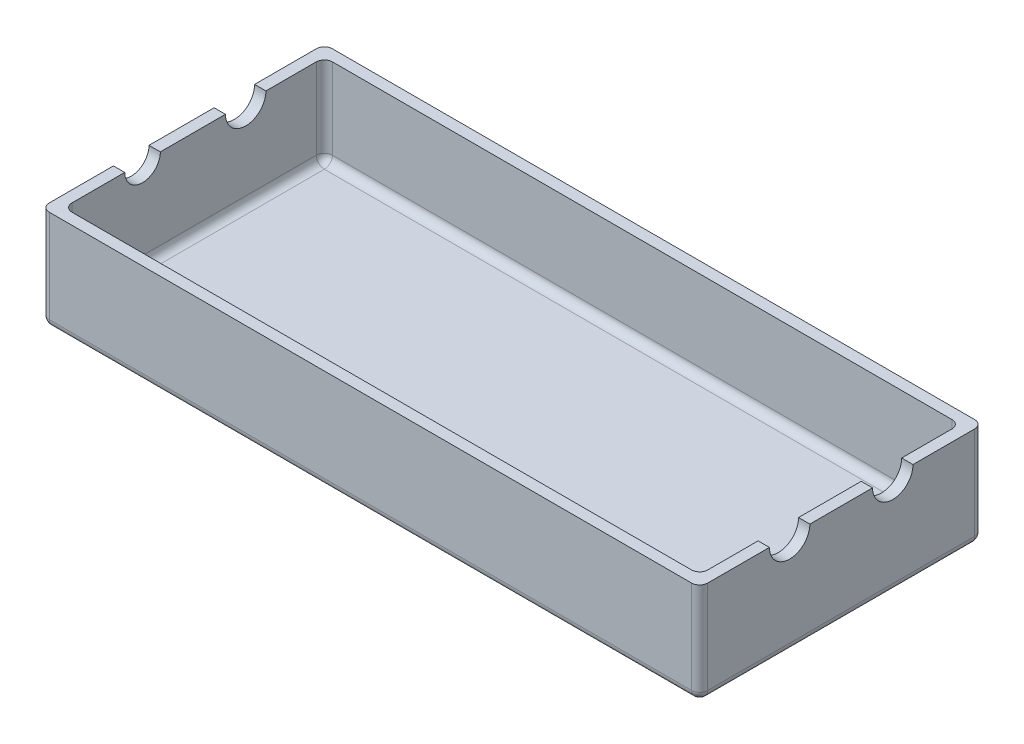
ISO-10303-21;
HEADER;
FILE_DESCRIPTION(('STEP AP214'),'2;1');
FILE_NAME('part.step','',(''),(''),'','','');
FILE_SCHEMA(('AUTOMOTIVE_DESIGN { 1 0 10303 214 1 1 1 1 }'));
ENDSEC;
DATA;
#1=APPLICATION_CONTEXT('core data for automotive mechanical design processes');
#2=APPLICATION_PROTOCOL_DEFINITION('international standard','automotive_design',2000,#1);
#3=PRODUCT_CONTEXT('',#1,'mechanical');
#4=PRODUCT('Part','Part','',(#3));
#5=PRODUCT_RELATED_PRODUCT_CATEGORY('part','',(#4));
#6=PRODUCT_DEFINITION_FORMATION('','',#4);
#7=PRODUCT_DEFINITION_CONTEXT('part definition',#1,'design');
#8=PRODUCT_DEFINITION('design','',#6,#7);
#9=PRODUCT_DEFINITION_SHAPE('','',#8);
#10=(LENGTH_UNIT() NAMED_UNIT(*) SI_UNIT(.MILLI.,.METRE.));
#11=(NAMED_UNIT(*) PLANE_ANGLE_UNIT() SI_UNIT($,.RADIAN.));
#12=(NAMED_UNIT(*) SI_UNIT($,.STERADIAN.) SOLID_ANGLE_UNIT());
#13=UNCERTAINTY_MEASURE_WITH_UNIT(LENGTH_MEASURE(1.E-05),#10,'distance_accuracy_value','');
#14=(GEOMETRIC_REPRESENTATION_CONTEXT(3) GLOBAL_UNCERTAINTY_ASSIGNED_CONTEXT((#13)) GLOBAL_UNIT_ASSIGNED_CONTEXT((#10,
#11,#12)) REPRESENTATION_CONTEXT('',''));
#15=CARTESIAN_POINT('',(0.,0.,0.));
#16=DIRECTION('',(0.,0.,1.));
#17=DIRECTION('',(1.,0.,0.));
#18=AXIS2_PLACEMENT_3D('',#15,#16,#17);
#19=CARTESIAN_POINT('',(0.,125.,0.));
#20=DIRECTION('',(0.,1.,0.));
#21=DIRECTION('',(0.,0.,1.));
#22=AXIS2_PLACEMENT_3D('',#19,#20,#21);
#23=PLANE('',#22);
#24=DIRECTION('',(1.,0.,0.));
#25=VECTOR('',#24,1.);
#26=CARTESIAN_POINT('',(297.,125.,88.75));
#27=LINE('',#26,#25);
#28=CARTESIAN_POINT('',(393.,125.,88.75));
#29=VERTEX_POINT('',#28);
#30=CARTESIAN_POINT('',(407.,125.,88.75));
#31=VERTEX_POINT('',#30);
#32=EDGE_CURVE('E427',#29,#31,#27,.T.);
#33=ORIENTED_EDGE('',*,*,#32,.F.);
#34=DIRECTION('',(0.,0.,-1.));
#35=VECTOR('',#34,1.);
#36=CARTESIAN_POINT('',(393.,125.,161.));
#37=LINE('',#36,#35);
#38=CARTESIAN_POINT('',(393.,125.,151.));
#39=VERTEX_POINT('',#38);
#40=EDGE_CURVE('E442',#39,#29,#37,.T.);
#41=ORIENTED_EDGE('',*,*,#40,.F.);
#42=CARTESIAN_POINT('',(383.,125.,151.));
#43=DIRECTION('',(0.,1.,0.));
#44=DIRECTION('',(0.,0.,1.));
#45=AXIS2_PLACEMENT_3D('',#42,#43,#44);
#46=CIRCLE('',#45,10.);
#47=CARTESIAN_POINT('',(383.,125.,161.));
#48=VERTEX_POINT('',#47);
#49=EDGE_CURVE('E369',#39,#48,#46,.F.);
#50=ORIENTED_EDGE('',*,*,#49,.T.);
#51=DIRECTION('',(1.,0.,0.));
#52=VECTOR('',#51,1.);
#53=CARTESIAN_POINT('',(-393.,125.,161.));
#54=LINE('',#53,#52);
#55=CARTESIAN_POINT('',(-383.,125.,161.));
#56=VERTEX_POINT('',#55);
#57=EDGE_CURVE('E451',#56,#48,#54,.T.);
#58=ORIENTED_EDGE('',*,*,#57,.F.);
#59=CARTESIAN_POINT('',(-383.,125.,151.));
#60=DIRECTION('',(0.,1.,0.));
#61=DIRECTION('',(0.,0.,1.));
#62=AXIS2_PLACEMENT_3D('',#59,#60,#61);
#63=CIRCLE('',#62,10.);
#64=CARTESIAN_POINT('',(-393.,125.,151.));
#65=VERTEX_POINT('',#64);
#66=EDGE_CURVE('E371',#56,#65,#63,.F.);
#67=ORIENTED_EDGE('',*,*,#66,.T.);
#68=DIRECTION('',(0.,0.,1.));
#69=VECTOR('',#68,1.);
#70=CARTESIAN_POINT('',(-393.,125.,161.));
#71=LINE('',#70,#69);
#72=CARTESIAN_POINT('',(-393.,125.,85.75));
#73=VERTEX_POINT('',#72);
#74=EDGE_CURVE('E447',#73,#65,#71,.T.);
#75=ORIENTED_EDGE('',*,*,#74,.F.);
#76=DIRECTION('',(-1.,0.,0.));
#77=VECTOR('',#76,1.);
#78=CARTESIAN_POINT('',(-297.,125.,85.75));
#79=LINE('',#78,#77);
#80=CARTESIAN_POINT('',(-407.,125.,85.75));
#81=VERTEX_POINT('',#80);
#82=EDGE_CURVE('E434',#81,#73,#79,.F.);
#83=ORIENTED_EDGE('',*,*,#82,.F.);
#84=DIRECTION('',(0.,0.,1.));
#85=VECTOR('',#84,1.);
#86=CARTESIAN_POINT('',(-407.,125.,175.));
#87=LINE('',#86,#85);
#88=CARTESIAN_POINT('',(-407.,125.,165.));
#89=VERTEX_POINT('',#88);
#90=EDGE_CURVE('E455',#81,#89,#87,.T.);
#91=ORIENTED_EDGE('',*,*,#90,.T.);
#92=CARTESIAN_POINT('',(-397.,125.,165.));
#93=DIRECTION('',(0.,1.,0.));
#94=DIRECTION('',(0.,0.,1.));
#95=AXIS2_PLACEMENT_3D('',#92,#93,#94);
#96=CIRCLE('',#95,10.);
#97=CARTESIAN_POINT('',(-397.,125.,175.));
#98=VERTEX_POINT('',#97);
#99=EDGE_CURVE('E313',#89,#98,#96,.T.);
#100=ORIENTED_EDGE('',*,*,#99,.T.);
#101=DIRECTION('',(1.,0.,0.));
#102=VECTOR('',#101,1.);
#103=CARTESIAN_POINT('',(407.,125.,175.));
#104=LINE('',#103,#102);
#105=CARTESIAN_POINT('',(397.,125.,175.));
#106=VERTEX_POINT('',#105);
#107=EDGE_CURVE('E241',#98,#106,#104,.T.);
#108=ORIENTED_EDGE('',*,*,#107,.T.);
#109=CARTESIAN_POINT('',(397.,125.,165.));
#110=DIRECTION('',(0.,1.,0.));
#111=DIRECTION('',(0.,0.,1.));
#112=AXIS2_PLACEMENT_3D('',#109,#110,#111);
#113=CIRCLE('',#112,10.);
#114=CARTESIAN_POINT('',(407.,125.,165.));
#115=VERTEX_POINT('',#114);
#116=EDGE_CURVE('E311',#106,#115,#113,.T.);
#117=ORIENTED_EDGE('',*,*,#116,.T.);
#118=DIRECTION('',(0.,0.,-1.));
#119=VECTOR('',#118,1.);
#120=CARTESIAN_POINT('',(407.,125.,175.));
#121=LINE('',#120,#119);
#122=EDGE_CURVE('E243',#115,#31,#121,.T.);
#123=ORIENTED_EDGE('',*,*,#122,.T.);
#124=EDGE_LOOP('',(#33,#41,#50,#58,#67,#75,#83,#91,#100,#108,#117,#123));
#125=FACE_BOUND('',#124,.T.);
#126=ADVANCED_FACE('F35',(#125),#23,.T.);
#127=DIRECTION('',(1.,0.,0.));
#128=VECTOR('',#127,1.);
#129=CARTESIAN_POINT('',(297.,125.,38.75));
#130=LINE('',#129,#128);
#131=CARTESIAN_POINT('',(407.,125.,38.75));
#132=VERTEX_POINT('',#131);
#133=CARTESIAN_POINT('',(393.,125.,38.75));
#134=VERTEX_POINT('',#133);
#135=EDGE_CURVE('E58',#132,#134,#130,.F.);
#136=ORIENTED_EDGE('',*,*,#135,.F.);
#137=CARTESIAN_POINT('',(407.,125.,-38.75));
#138=VERTEX_POINT('',#137);
#139=EDGE_CURVE('E240',#132,#138,#121,.T.);
#140=ORIENTED_EDGE('',*,*,#139,.T.);
#141=DIRECTION('',(1.,0.,0.));
#142=VECTOR('',#141,1.);
#143=CARTESIAN_POINT('',(297.,125.,-38.75));
#144=LINE('',#143,#142);
#145=CARTESIAN_POINT('',(393.,125.,-38.75));
#146=VERTEX_POINT('',#145);
#147=EDGE_CURVE('E220',#146,#138,#144,.T.);
#148=ORIENTED_EDGE('',*,*,#147,.F.);
#149=EDGE_CURVE('E423',#134,#146,#37,.T.);
#150=ORIENTED_EDGE('',*,*,#149,.F.);
#151=EDGE_LOOP('',(#136,#140,#148,#150));
#152=FACE_BOUND('',#151,.T.);
#153=ADVANCED_FACE('F425',(#152),#23,.T.);
#154=DIRECTION('',(1.,0.,0.));
#155=VECTOR('',#154,1.);
#156=CARTESIAN_POINT('',(297.,125.,-88.75));
#157=LINE('',#156,#155);
#158=CARTESIAN_POINT('',(407.,125.,-88.75));
#159=VERTEX_POINT('',#158);
#160=CARTESIAN_POINT('',(393.,125.,-88.75));
#161=VERTEX_POINT('',#160);
#162=EDGE_CURVE('E50',#159,#161,#157,.F.);
#163=ORIENTED_EDGE('',*,*,#162,.F.);
#164=CARTESIAN_POINT('',(407.,125.,-165.));
#165=VERTEX_POINT('',#164);
#166=EDGE_CURVE('E230',#159,#165,#121,.T.);
#167=ORIENTED_EDGE('',*,*,#166,.T.);
#168=CARTESIAN_POINT('',(397.,125.,-165.));
#169=DIRECTION('',(0.,1.,0.));
#170=DIRECTION('',(0.,0.,1.));
#171=AXIS2_PLACEMENT_3D('',#168,#169,#170);
#172=CIRCLE('',#171,10.);
#173=CARTESIAN_POINT('',(397.,125.,-175.));
#174=VERTEX_POINT('',#173);
#175=EDGE_CURVE('E309',#165,#174,#172,.T.);
#176=ORIENTED_EDGE('',*,*,#175,.T.);
#177=DIRECTION('',(-1.,0.,0.));
#178=VECTOR('',#177,1.);
#179=CARTESIAN_POINT('',(407.,125.,-175.));
#180=LINE('',#179,#178);
#181=CARTESIAN_POINT('',(-397.,125.,-175.));
#182=VERTEX_POINT('',#181);
#183=EDGE_CURVE('E249',#174,#182,#180,.T.);
#184=ORIENTED_EDGE('',*,*,#183,.T.);
#185=CARTESIAN_POINT('',(-397.,125.,-165.));
#186=DIRECTION('',(0.,1.,0.));
#187=DIRECTION('',(0.,0.,1.));
#188=AXIS2_PLACEMENT_3D('',#185,#186,#187);
#189=CIRCLE('',#188,10.);
#190=CARTESIAN_POINT('',(-407.,125.,-165.));
#191=VERTEX_POINT('',#190);
#192=EDGE_CURVE('E315',#182,#191,#189,.T.);
#193=ORIENTED_EDGE('',*,*,#192,.T.);
#194=CARTESIAN_POINT('',(-407.,125.,-88.75));
#195=VERTEX_POINT('',#194);
#196=EDGE_CURVE('E245',#191,#195,#87,.T.);
#197=ORIENTED_EDGE('',*,*,#196,.T.);
#198=DIRECTION('',(-1.,0.,0.));
#199=VECTOR('',#198,1.);
#200=CARTESIAN_POINT('',(-297.,125.,-88.75));
#201=LINE('',#200,#199);
#202=CARTESIAN_POINT('',(-393.,125.,-88.75));
#203=VERTEX_POINT('',#202);
#204=EDGE_CURVE('E383',#203,#195,#201,.T.);
#205=ORIENTED_EDGE('',*,*,#204,.F.);
#206=CARTESIAN_POINT('',(-393.,125.,-151.));
#207=VERTEX_POINT('',#206);
#208=EDGE_CURVE('E448',#207,#203,#71,.T.);
#209=ORIENTED_EDGE('',*,*,#208,.F.);
#210=CARTESIAN_POINT('',(-383.,125.,-151.));
#211=DIRECTION('',(0.,1.,0.));
#212=DIRECTION('',(0.,0.,1.));
#213=AXIS2_PLACEMENT_3D('',#210,#211,#212);
#214=CIRCLE('',#213,10.);
#215=CARTESIAN_POINT('',(-383.,125.,-161.));
#216=VERTEX_POINT('',#215);
#217=EDGE_CURVE('E374',#207,#216,#214,.F.);
#218=ORIENTED_EDGE('',*,*,#217,.T.);
#219=DIRECTION('',(-1.,0.,0.));
#220=VECTOR('',#219,1.);
#221=CARTESIAN_POINT('',(-393.,125.,-161.));
#222=LINE('',#221,#220);
#223=CARTESIAN_POINT('',(383.,125.,-161.));
#224=VERTEX_POINT('',#223);
#225=EDGE_CURVE('E444',#224,#216,#222,.T.);
#226=ORIENTED_EDGE('',*,*,#225,.F.);
#227=CARTESIAN_POINT('',(383.,125.,-151.));
#228=DIRECTION('',(0.,1.,0.));
#229=DIRECTION('',(0.,0.,1.));
#230=AXIS2_PLACEMENT_3D('',#227,#228,#229);
#231=CIRCLE('',#230,10.);
#232=CARTESIAN_POINT('',(393.,125.,-151.));
#233=VERTEX_POINT('',#232);
#234=EDGE_CURVE('E376',#224,#233,#231,.F.);
#235=ORIENTED_EDGE('',*,*,#234,.T.);
#236=EDGE_CURVE('E233',#161,#233,#37,.T.);
#237=ORIENTED_EDGE('',*,*,#236,.F.);
#238=EDGE_LOOP('',(#163,#167,#176,#184,#193,#197,#205,#209,#218,#226,#235,#237));
#239=FACE_BOUND('',#238,.T.);
#240=ADVANCED_FACE('F229',(#239),#23,.T.);
#241=CARTESIAN_POINT('',(-407.,125.,175.));
#242=DIRECTION('',(1.,0.,0.));
#243=DIRECTION('',(0.,0.,-1.));
#244=AXIS2_PLACEMENT_3D('',#241,#242,#243);
#245=PLANE('',#244);
#246=CARTESIAN_POINT('',(-407.,125.,-38.75));
#247=VERTEX_POINT('',#246);
#248=CARTESIAN_POINT('',(-407.,125.,41.75));
#249=VERTEX_POINT('',#248);
#250=EDGE_CURVE('E457',#247,#249,#87,.T.);
#251=ORIENTED_EDGE('',*,*,#250,.F.);
#252=CARTESIAN_POINT('',(-407.,125.,-63.75));
#253=DIRECTION('',(-1.,0.,0.));
#254=DIRECTION('',(0.,0.,1.));
#255=AXIS2_PLACEMENT_3D('',#252,#253,#254);
#256=CIRCLE('',#255,25.);
#257=EDGE_CURVE('E432',#195,#247,#256,.T.);
#258=ORIENTED_EDGE('',*,*,#257,.F.);
#259=ORIENTED_EDGE('',*,*,#196,.F.);
#260=DIRECTION('',(0.,-1.,0.));
#261=VECTOR('',#260,1.);
#262=CARTESIAN_POINT('',(-407.,125.,-165.));
#263=LINE('',#262,#261);
#264=CARTESIAN_POINT('',(-407.,9.99999999999999,-165.));
#265=VERTEX_POINT('',#264);
#266=EDGE_CURVE('E303',#191,#265,#263,.T.);
#267=ORIENTED_EDGE('',*,*,#266,.T.);
#268=DIRECTION('',(0.,0.,1.));
#269=VECTOR('',#268,1.);
#270=CARTESIAN_POINT('',(-407.,9.99999999999999,175.));
#271=LINE('',#270,#269);
#272=CARTESIAN_POINT('',(-407.,9.99999999999999,165.));
#273=VERTEX_POINT('',#272);
#274=EDGE_CURVE('E254',#265,#273,#271,.T.);
#275=ORIENTED_EDGE('',*,*,#274,.T.);
#276=DIRECTION('',(0.,-1.,0.));
#277=VECTOR('',#276,1.);
#278=CARTESIAN_POINT('',(-407.,125.,165.));
#279=LINE('',#278,#277);
#280=EDGE_CURVE('E300',#273,#89,#279,.F.);
#281=ORIENTED_EDGE('',*,*,#280,.T.);
#282=ORIENTED_EDGE('',*,*,#90,.F.);
#283=CARTESIAN_POINT('',(-407.,125.,63.75));
#284=DIRECTION('',(-1.,0.,0.));
#285=DIRECTION('',(0.,0.,1.));
#286=AXIS2_PLACEMENT_3D('',#283,#284,#285);
#287=CIRCLE('',#286,22.);
#288=EDGE_CURVE('E431',#249,#81,#287,.T.);
#289=ORIENTED_EDGE('',*,*,#288,.F.);
#290=EDGE_LOOP('',(#251,#258,#259,#267,#275,#281,#282,#289));
#291=FACE_BOUND('',#290,.T.);
#292=ADVANCED_FACE('F470',(#291),#245,.F.);
#293=CARTESIAN_POINT('',(407.,125.,175.));
#294=DIRECTION('',(0.,0.,-1.));
#295=DIRECTION('',(-1.,0.,0.));
#296=AXIS2_PLACEMENT_3D('',#293,#294,#295);
#297=PLANE('',#296);
#298=ORIENTED_EDGE('',*,*,#107,.F.);
#299=DIRECTION('',(0.,-1.,0.));
#300=VECTOR('',#299,1.);
#301=CARTESIAN_POINT('',(-397.,125.,175.));
#302=LINE('',#301,#300);
#303=CARTESIAN_POINT('',(-397.,9.99999999999999,175.));
#304=VERTEX_POINT('',#303);
#305=EDGE_CURVE('E319',#98,#304,#302,.T.);
#306=ORIENTED_EDGE('',*,*,#305,.T.);
#307=DIRECTION('',(1.,0.,0.));
#308=VECTOR('',#307,1.);
#309=CARTESIAN_POINT('',(407.,9.99999999999999,175.));
#310=LINE('',#309,#308);
#311=CARTESIAN_POINT('',(397.,9.99999999999999,175.));
#312=VERTEX_POINT('',#311);
#313=EDGE_CURVE('E277',#304,#312,#310,.T.);
#314=ORIENTED_EDGE('',*,*,#313,.T.);
#315=DIRECTION('',(0.,-1.,0.));
#316=VECTOR('',#315,1.);
#317=CARTESIAN_POINT('',(397.,125.,175.));
#318=LINE('',#317,#316);
#319=EDGE_CURVE('E317',#312,#106,#318,.F.);
#320=ORIENTED_EDGE('',*,*,#319,.T.);
#321=EDGE_LOOP('',(#298,#306,#314,#320));
#322=FACE_BOUND('',#321,.T.);
#323=ADVANCED_FACE('F478',(#322),#297,.F.);
#324=CARTESIAN_POINT('',(407.,125.,175.));
#325=DIRECTION('',(-1.,0.,0.));
#326=DIRECTION('',(0.,0.,1.));
#327=AXIS2_PLACEMENT_3D('',#324,#325,#326);
#328=PLANE('',#327);
#329=ORIENTED_EDGE('',*,*,#139,.F.);
#330=CARTESIAN_POINT('',(407.,125.,63.75));
#331=DIRECTION('',(1.,0.,0.));
#332=DIRECTION('',(0.,0.,-1.));
#333=AXIS2_PLACEMENT_3D('',#330,#331,#332);
#334=CIRCLE('',#333,25.);
#335=EDGE_CURVE('E225',#31,#132,#334,.T.);
#336=ORIENTED_EDGE('',*,*,#335,.F.);
#337=ORIENTED_EDGE('',*,*,#122,.F.);
#338=DIRECTION('',(0.,-1.,0.));
#339=VECTOR('',#338,1.);
#340=CARTESIAN_POINT('',(407.,125.,165.));
#341=LINE('',#340,#339);
#342=CARTESIAN_POINT('',(407.,9.99999999999999,165.));
#343=VERTEX_POINT('',#342);
#344=EDGE_CURVE('E322',#115,#343,#341,.T.);
#345=ORIENTED_EDGE('',*,*,#344,.T.);
#346=DIRECTION('',(0.,0.,-1.));
#347=VECTOR('',#346,1.);
#348=CARTESIAN_POINT('',(407.,9.99999999999999,175.));
#349=LINE('',#348,#347);
#350=CARTESIAN_POINT('',(407.,9.99999999999999,-165.));
#351=VERTEX_POINT('',#350);
#352=EDGE_CURVE('E275',#343,#351,#349,.T.);
#353=ORIENTED_EDGE('',*,*,#352,.T.);
#354=DIRECTION('',(0.,-1.,0.));
#355=VECTOR('',#354,1.);
#356=CARTESIAN_POINT('',(407.,125.,-165.));
#357=LINE('',#356,#355);
#358=EDGE_CURVE('E238',#351,#165,#357,.F.);
#359=ORIENTED_EDGE('',*,*,#358,.T.);
#360=ORIENTED_EDGE('',*,*,#166,.F.);
#361=CARTESIAN_POINT('',(407.,125.,-63.75));
#362=DIRECTION('',(1.,0.,0.));
#363=DIRECTION('',(0.,0.,-1.));
#364=AXIS2_PLACEMENT_3D('',#361,#362,#363);
#365=CIRCLE('',#364,25.);
#366=EDGE_CURVE('E217',#138,#159,#365,.T.);
#367=ORIENTED_EDGE('',*,*,#366,.F.);
#368=EDGE_LOOP('',(#329,#336,#337,#345,#353,#359,#360,#367));
#369=FACE_BOUND('',#368,.T.);
#370=ADVANCED_FACE('F235',(#369),#328,.F.);
#371=CARTESIAN_POINT('',(407.,125.,-175.));
#372=DIRECTION('',(0.,0.,1.));
#373=DIRECTION('',(1.,0.,0.));
#374=AXIS2_PLACEMENT_3D('',#371,#372,#373);
#375=PLANE('',#374);
#376=DIRECTION('',(-1.,0.,0.));
#377=VECTOR('',#376,1.);
#378=CARTESIAN_POINT('',(407.,9.99999999999999,-175.));
#379=LINE('',#378,#377);
#380=CARTESIAN_POINT('',(397.,9.99999999999999,-175.));
#381=VERTEX_POINT('',#380);
#382=CARTESIAN_POINT('',(-397.,9.99999999999999,-175.));
#383=VERTEX_POINT('',#382);
#384=EDGE_CURVE('E272',#381,#383,#379,.T.);
#385=ORIENTED_EDGE('',*,*,#384,.T.);
#386=DIRECTION('',(0.,-1.,0.));
#387=VECTOR('',#386,1.);
#388=CARTESIAN_POINT('',(-397.,125.,-175.));
#389=LINE('',#388,#387);
#390=EDGE_CURVE('E307',#383,#182,#389,.F.);
#391=ORIENTED_EDGE('',*,*,#390,.T.);
#392=ORIENTED_EDGE('',*,*,#183,.F.);
#393=DIRECTION('',(0.,-1.,0.));
#394=VECTOR('',#393,1.);
#395=CARTESIAN_POINT('',(397.,125.,-175.));
#396=LINE('',#395,#394);
#397=EDGE_CURVE('E305',#174,#381,#396,.T.);
#398=ORIENTED_EDGE('',*,*,#397,.T.);
#399=EDGE_LOOP('',(#385,#391,#392,#398));
#400=FACE_BOUND('',#399,.T.);
#401=ADVANCED_FACE('F597',(#400),#375,.F.);
#402=DIRECTION('',(-1.,0.,0.));
#403=VECTOR('',#402,1.);
#404=CARTESIAN_POINT('',(-297.,125.,-38.75));
#405=LINE('',#404,#403);
#406=CARTESIAN_POINT('',(-393.,125.,-38.75));
#407=VERTEX_POINT('',#406);
#408=EDGE_CURVE('E439',#247,#407,#405,.F.);
#409=ORIENTED_EDGE('',*,*,#408,.F.);
#410=ORIENTED_EDGE('',*,*,#250,.T.);
#411=DIRECTION('',(-1.,0.,0.));
#412=VECTOR('',#411,1.);
#413=CARTESIAN_POINT('',(-297.,125.,41.75));
#414=LINE('',#413,#412);
#415=CARTESIAN_POINT('',(-393.,125.,41.75));
#416=VERTEX_POINT('',#415);
#417=EDGE_CURVE('E437',#416,#249,#414,.T.);
#418=ORIENTED_EDGE('',*,*,#417,.F.);
#419=EDGE_CURVE('E452',#407,#416,#71,.T.);
#420=ORIENTED_EDGE('',*,*,#419,.F.);
#421=EDGE_LOOP('',(#409,#410,#418,#420));
#422=FACE_BOUND('',#421,.T.);
#423=ADVANCED_FACE('F575',(#422),#23,.T.);
#424=CARTESIAN_POINT('',(0.,0.,0.));
#425=DIRECTION('',(0.,1.,0.));
#426=DIRECTION('',(0.,0.,1.));
#427=AXIS2_PLACEMENT_3D('',#424,#425,#426);
#428=PLANE('',#427);
#429=DIRECTION('',(1.,0.,0.));
#430=VECTOR('',#429,1.);
#431=CARTESIAN_POINT('',(0.,0.,165.));
#432=LINE('',#431,#430);
#433=CARTESIAN_POINT('',(397.,0.,165.));
#434=VERTEX_POINT('',#433);
#435=CARTESIAN_POINT('',(-397.,0.,165.));
#436=VERTEX_POINT('',#435);
#437=EDGE_CURVE('E258',#434,#436,#432,.F.);
#438=ORIENTED_EDGE('',*,*,#437,.T.);
#439=DIRECTION('',(0.,0.,1.));
#440=VECTOR('',#439,1.);
#441=CARTESIAN_POINT('',(-397.,0.,0.));
#442=LINE('',#441,#440);
#443=CARTESIAN_POINT('',(-397.,0.,-165.));
#444=VERTEX_POINT('',#443);
#445=EDGE_CURVE('E269',#436,#444,#442,.F.);
#446=ORIENTED_EDGE('',*,*,#445,.T.);
#447=DIRECTION('',(-1.,0.,0.));
#448=VECTOR('',#447,1.);
#449=CARTESIAN_POINT('',(0.,0.,-165.));
#450=LINE('',#449,#448);
#451=CARTESIAN_POINT('',(397.,0.,-165.));
#452=VERTEX_POINT('',#451);
#453=EDGE_CURVE('E266',#444,#452,#450,.F.);
#454=ORIENTED_EDGE('',*,*,#453,.T.);
#455=DIRECTION('',(0.,0.,-1.));
#456=VECTOR('',#455,1.);
#457=CARTESIAN_POINT('',(397.,0.,0.));
#458=LINE('',#457,#456);
#459=EDGE_CURVE('E263',#452,#434,#458,.F.);
#460=ORIENTED_EDGE('',*,*,#459,.T.);
#461=EDGE_LOOP('',(#438,#446,#454,#460));
#462=FACE_BOUND('',#461,.T.);
#463=ADVANCED_FACE('F494',(#462),#428,.F.);
#464=CARTESIAN_POINT('',(393.,15.,161.));
#465=DIRECTION('',(1.,0.,0.));
#466=DIRECTION('',(0.,0.,-1.));
#467=AXIS2_PLACEMENT_3D('',#464,#465,#466);
#468=PLANE('',#467);
#469=ORIENTED_EDGE('',*,*,#40,.T.);
#470=CARTESIAN_POINT('',(393.,125.,63.75));
#471=DIRECTION('',(1.,0.,0.));
#472=DIRECTION('',(0.,0.,-1.));
#473=AXIS2_PLACEMENT_3D('',#470,#471,#472);
#474=CIRCLE('',#473,25.);
#475=EDGE_CURVE('E11',#29,#134,#474,.T.);
#476=ORIENTED_EDGE('',*,*,#475,.T.);
#477=ORIENTED_EDGE('',*,*,#149,.T.);
#478=CARTESIAN_POINT('',(393.,125.,-63.75));
#479=DIRECTION('',(1.,0.,0.));
#480=DIRECTION('',(0.,0.,-1.));
#481=AXIS2_PLACEMENT_3D('',#478,#479,#480);
#482=CIRCLE('',#481,25.);
#483=EDGE_CURVE('E43',#146,#161,#482,.T.);
#484=ORIENTED_EDGE('',*,*,#483,.T.);
#485=ORIENTED_EDGE('',*,*,#236,.T.);
#486=DIRECTION('',(0.,1.,0.));
#487=VECTOR('',#486,1.);
#488=CARTESIAN_POINT('',(393.,15.,-151.));
#489=LINE('',#488,#487);
#490=CARTESIAN_POINT('',(393.,25.,-151.));
#491=VERTEX_POINT('',#490);
#492=EDGE_CURVE('E324',#233,#491,#489,.F.);
#493=ORIENTED_EDGE('',*,*,#492,.T.);
#494=DIRECTION('',(0.,0.,-1.));
#495=VECTOR('',#494,1.);
#496=CARTESIAN_POINT('',(393.,25.,161.));
#497=LINE('',#496,#495);
#498=CARTESIAN_POINT('',(393.,25.,151.));
#499=VERTEX_POINT('',#498);
#500=EDGE_CURVE('E337',#491,#499,#497,.F.);
#501=ORIENTED_EDGE('',*,*,#500,.T.);
#502=DIRECTION('',(0.,1.,0.));
#503=VECTOR('',#502,1.);
#504=CARTESIAN_POINT('',(393.,125.,151.));
#505=LINE('',#504,#503);
#506=EDGE_CURVE('E339',#499,#39,#505,.T.);
#507=ORIENTED_EDGE('',*,*,#506,.T.);
#508=EDGE_LOOP('',(#469,#476,#477,#484,#485,#493,#501,#507));
#509=FACE_BOUND('',#508,.T.);
#510=ADVANCED_FACE('F421',(#509),#468,.F.);
#511=CARTESIAN_POINT('',(-393.,15.,161.));
#512=DIRECTION('',(0.,0.,1.));
#513=DIRECTION('',(1.,0.,0.));
#514=AXIS2_PLACEMENT_3D('',#511,#512,#513);
#515=PLANE('',#514);
#516=ORIENTED_EDGE('',*,*,#57,.T.);
#517=DIRECTION('',(0.,1.,0.));
#518=VECTOR('',#517,1.);
#519=CARTESIAN_POINT('',(383.,15.,161.));
#520=LINE('',#519,#518);
#521=CARTESIAN_POINT('',(383.,25.,161.));
#522=VERTEX_POINT('',#521);
#523=EDGE_CURVE('E346',#48,#522,#520,.F.);
#524=ORIENTED_EDGE('',*,*,#523,.T.);
#525=DIRECTION('',(1.,0.,0.));
#526=VECTOR('',#525,1.);
#527=CARTESIAN_POINT('',(-393.,25.,161.));
#528=LINE('',#527,#526);
#529=CARTESIAN_POINT('',(-383.,25.,161.));
#530=VERTEX_POINT('',#529);
#531=EDGE_CURVE('E344',#522,#530,#528,.F.);
#532=ORIENTED_EDGE('',*,*,#531,.T.);
#533=DIRECTION('',(0.,1.,0.));
#534=VECTOR('',#533,1.);
#535=CARTESIAN_POINT('',(-383.,125.,161.));
#536=LINE('',#535,#534);
#537=EDGE_CURVE('E342',#530,#56,#536,.T.);
#538=ORIENTED_EDGE('',*,*,#537,.T.);
#539=EDGE_LOOP('',(#516,#524,#532,#538));
#540=FACE_BOUND('',#539,.T.);
#541=ADVANCED_FACE('F520',(#540),#515,.F.);
#542=CARTESIAN_POINT('',(-393.,15.,161.));
#543=DIRECTION('',(-1.,0.,0.));
#544=DIRECTION('',(0.,0.,1.));
#545=AXIS2_PLACEMENT_3D('',#542,#543,#544);
#546=PLANE('',#545);
#547=ORIENTED_EDGE('',*,*,#208,.T.);
#548=CARTESIAN_POINT('',(-393.,125.,-63.75));
#549=DIRECTION('',(-1.,0.,0.));
#550=DIRECTION('',(0.,0.,1.));
#551=AXIS2_PLACEMENT_3D('',#548,#549,#550);
#552=CIRCLE('',#551,25.);
#553=EDGE_CURVE('E416',#203,#407,#552,.T.);
#554=ORIENTED_EDGE('',*,*,#553,.T.);
#555=ORIENTED_EDGE('',*,*,#419,.T.);
#556=CARTESIAN_POINT('',(-393.,125.,63.75));
#557=DIRECTION('',(-1.,0.,0.));
#558=DIRECTION('',(0.,0.,1.));
#559=AXIS2_PLACEMENT_3D('',#556,#557,#558);
#560=CIRCLE('',#559,22.);
#561=EDGE_CURVE('E378',#416,#73,#560,.T.);
#562=ORIENTED_EDGE('',*,*,#561,.T.);
#563=ORIENTED_EDGE('',*,*,#74,.T.);
#564=DIRECTION('',(0.,1.,0.));
#565=VECTOR('',#564,1.);
#566=CARTESIAN_POINT('',(-393.,15.,151.));
#567=LINE('',#566,#565);
#568=CARTESIAN_POINT('',(-393.,25.,151.));
#569=VERTEX_POINT('',#568);
#570=EDGE_CURVE('E361',#65,#569,#567,.F.);
#571=ORIENTED_EDGE('',*,*,#570,.T.);
#572=DIRECTION('',(0.,0.,1.));
#573=VECTOR('',#572,1.);
#574=CARTESIAN_POINT('',(-393.,25.,-161.));
#575=LINE('',#574,#573);
#576=CARTESIAN_POINT('',(-393.,25.,-151.));
#577=VERTEX_POINT('',#576);
#578=EDGE_CURVE('E359',#569,#577,#575,.F.);
#579=ORIENTED_EDGE('',*,*,#578,.T.);
#580=DIRECTION('',(0.,1.,0.));
#581=VECTOR('',#580,1.);
#582=CARTESIAN_POINT('',(-393.,125.,-151.));
#583=LINE('',#582,#581);
#584=EDGE_CURVE('E357',#577,#207,#583,.T.);
#585=ORIENTED_EDGE('',*,*,#584,.T.);
#586=EDGE_LOOP('',(#547,#554,#555,#562,#563,#571,#579,#585));
#587=FACE_BOUND('',#586,.T.);
#588=ADVANCED_FACE('F546',(#587),#546,.F.);
#589=CARTESIAN_POINT('',(-393.,15.,-161.));
#590=DIRECTION('',(0.,0.,-1.));
#591=DIRECTION('',(-1.,0.,0.));
#592=AXIS2_PLACEMENT_3D('',#589,#590,#591);
#593=PLANE('',#592);
#594=ORIENTED_EDGE('',*,*,#225,.T.);
#595=DIRECTION('',(0.,1.,0.));
#596=VECTOR('',#595,1.);
#597=CARTESIAN_POINT('',(-383.,15.,-161.));
#598=LINE('',#597,#596);
#599=CARTESIAN_POINT('',(-383.,25.,-161.));
#600=VERTEX_POINT('',#599);
#601=EDGE_CURVE('E367',#216,#600,#598,.F.);
#602=ORIENTED_EDGE('',*,*,#601,.T.);
#603=DIRECTION('',(-1.,0.,0.));
#604=VECTOR('',#603,1.);
#605=CARTESIAN_POINT('',(393.,25.,-161.));
#606=LINE('',#605,#604);
#607=CARTESIAN_POINT('',(383.,25.,-161.));
#608=VERTEX_POINT('',#607);
#609=EDGE_CURVE('E365',#600,#608,#606,.F.);
#610=ORIENTED_EDGE('',*,*,#609,.T.);
#611=DIRECTION('',(0.,1.,0.));
#612=VECTOR('',#611,1.);
#613=CARTESIAN_POINT('',(383.,125.,-161.));
#614=LINE('',#613,#612);
#615=EDGE_CURVE('E363',#608,#224,#614,.T.);
#616=ORIENTED_EDGE('',*,*,#615,.T.);
#617=EDGE_LOOP('',(#594,#602,#610,#616));
#618=FACE_BOUND('',#617,.T.);
#619=ADVANCED_FACE('F561',(#618),#593,.F.);
#620=CARTESIAN_POINT('',(0.,15.,0.));
#621=DIRECTION('',(0.,-1.,0.));
#622=DIRECTION('',(0.,0.,-1.));
#623=AXIS2_PLACEMENT_3D('',#620,#621,#622);
#624=PLANE('',#623);
#625=DIRECTION('',(0.,0.,1.));
#626=VECTOR('',#625,1.);
#627=CARTESIAN_POINT('',(-383.,15.,161.));
#628=LINE('',#627,#626);
#629=CARTESIAN_POINT('',(-383.,15.,-151.));
#630=VERTEX_POINT('',#629);
#631=CARTESIAN_POINT('',(-383.,15.,151.));
#632=VERTEX_POINT('',#631);
#633=EDGE_CURVE('E352',#630,#632,#628,.T.);
#634=ORIENTED_EDGE('',*,*,#633,.T.);
#635=DIRECTION('',(1.,0.,0.));
#636=VECTOR('',#635,1.);
#637=CARTESIAN_POINT('',(393.,15.,151.));
#638=LINE('',#637,#636);
#639=CARTESIAN_POINT('',(383.,15.,151.));
#640=VERTEX_POINT('',#639);
#641=EDGE_CURVE('E354',#632,#640,#638,.T.);
#642=ORIENTED_EDGE('',*,*,#641,.T.);
#643=DIRECTION('',(0.,0.,-1.));
#644=VECTOR('',#643,1.);
#645=CARTESIAN_POINT('',(383.,15.,-161.));
#646=LINE('',#645,#644);
#647=CARTESIAN_POINT('',(383.,15.,-151.));
#648=VERTEX_POINT('',#647);
#649=EDGE_CURVE('E350',#640,#648,#646,.T.);
#650=ORIENTED_EDGE('',*,*,#649,.T.);
#651=DIRECTION('',(-1.,0.,0.));
#652=VECTOR('',#651,1.);
#653=CARTESIAN_POINT('',(-393.,15.,-151.));
#654=LINE('',#653,#652);
#655=EDGE_CURVE('E348',#648,#630,#654,.T.);
#656=ORIENTED_EDGE('',*,*,#655,.T.);
#657=EDGE_LOOP('',(#634,#642,#650,#656));
#658=FACE_BOUND('',#657,.T.);
#659=ADVANCED_FACE('F537',(#658),#624,.F.);
#660=CARTESIAN_POINT('',(397.,9.99999999999999,175.));
#661=DIRECTION('',(0.,0.,-1.));
#662=DIRECTION('',(-1.,0.,0.));
#663=AXIS2_PLACEMENT_3D('',#660,#661,#662);
#664=CYLINDRICAL_SURFACE('',#663,10.);
#665=ORIENTED_EDGE('',*,*,#352,.F.);
#666=CARTESIAN_POINT('',(397.,9.99999999999999,165.));
#667=DIRECTION('',(0.,0.,-1.));
#668=DIRECTION('',(-1.,0.,0.));
#669=AXIS2_PLACEMENT_3D('',#666,#667,#668);
#670=CIRCLE('',#669,10.);
#671=EDGE_CURVE('E298',#343,#434,#670,.T.);
#672=ORIENTED_EDGE('',*,*,#671,.T.);
#673=ORIENTED_EDGE('',*,*,#459,.F.);
#674=CARTESIAN_POINT('',(397.,9.99999999999999,-165.));
#675=DIRECTION('',(0.,0.,-1.));
#676=DIRECTION('',(-1.,0.,0.));
#677=AXIS2_PLACEMENT_3D('',#674,#675,#676);
#678=CIRCLE('',#677,10.);
#679=EDGE_CURVE('E296',#452,#351,#678,.F.);
#680=ORIENTED_EDGE('',*,*,#679,.T.);
#681=EDGE_LOOP('',(#665,#672,#673,#680));
#682=FACE_BOUND('',#681,.T.);
#683=ADVANCED_FACE('F623',(#682),#664,.T.);
#684=CARTESIAN_POINT('',(407.,9.99999999999999,-165.));
#685=DIRECTION('',(-1.,0.,0.));
#686=DIRECTION('',(0.,0.,1.));
#687=AXIS2_PLACEMENT_3D('',#684,#685,#686);
#688=CYLINDRICAL_SURFACE('',#687,10.);
#689=ORIENTED_EDGE('',*,*,#453,.F.);
#690=CARTESIAN_POINT('',(-397.,9.99999999999999,-165.));
#691=DIRECTION('',(-1.,0.,0.));
#692=DIRECTION('',(0.,0.,1.));
#693=AXIS2_PLACEMENT_3D('',#690,#691,#692);
#694=CIRCLE('',#693,10.);
#695=EDGE_CURVE('E289',#444,#383,#694,.F.);
#696=ORIENTED_EDGE('',*,*,#695,.T.);
#697=ORIENTED_EDGE('',*,*,#384,.F.);
#698=CARTESIAN_POINT('',(397.,9.99999999999999,-165.));
#699=DIRECTION('',(-1.,0.,0.));
#700=DIRECTION('',(0.,0.,1.));
#701=AXIS2_PLACEMENT_3D('',#698,#699,#700);
#702=CIRCLE('',#701,10.);
#703=EDGE_CURVE('E286',#381,#452,#702,.T.);
#704=ORIENTED_EDGE('',*,*,#703,.T.);
#705=EDGE_LOOP('',(#689,#696,#697,#704));
#706=FACE_BOUND('',#705,.T.);
#707=ADVANCED_FACE('F620',(#706),#688,.T.);
#708=CARTESIAN_POINT('',(407.,9.99999999999999,165.));
#709=DIRECTION('',(1.,0.,0.));
#710=DIRECTION('',(0.,0.,-1.));
#711=AXIS2_PLACEMENT_3D('',#708,#709,#710);
#712=CYLINDRICAL_SURFACE('',#711,10.);
#713=ORIENTED_EDGE('',*,*,#313,.F.);
#714=CARTESIAN_POINT('',(-397.,9.99999999999999,165.));
#715=DIRECTION('',(1.,0.,0.));
#716=DIRECTION('',(0.,0.,-1.));
#717=AXIS2_PLACEMENT_3D('',#714,#715,#716);
#718=CIRCLE('',#717,10.);
#719=EDGE_CURVE('E294',#304,#436,#718,.T.);
#720=ORIENTED_EDGE('',*,*,#719,.T.);
#721=ORIENTED_EDGE('',*,*,#437,.F.);
#722=CARTESIAN_POINT('',(397.,9.99999999999999,165.));
#723=DIRECTION('',(1.,0.,0.));
#724=DIRECTION('',(0.,0.,-1.));
#725=AXIS2_PLACEMENT_3D('',#722,#723,#724);
#726=CIRCLE('',#725,10.);
#727=EDGE_CURVE('E291',#434,#312,#726,.F.);
#728=ORIENTED_EDGE('',*,*,#727,.T.);
#729=EDGE_LOOP('',(#713,#720,#721,#728));
#730=FACE_BOUND('',#729,.T.);
#731=ADVANCED_FACE('F481',(#730),#712,.T.);
#732=CARTESIAN_POINT('',(-397.,9.99999999999999,175.));
#733=DIRECTION('',(0.,0.,1.));
#734=DIRECTION('',(1.,0.,0.));
#735=AXIS2_PLACEMENT_3D('',#732,#733,#734);
#736=CYLINDRICAL_SURFACE('',#735,10.);
#737=ORIENTED_EDGE('',*,*,#274,.F.);
#738=CARTESIAN_POINT('',(-397.,9.99999999999999,-165.));
#739=DIRECTION('',(0.,0.,1.));
#740=DIRECTION('',(1.,0.,0.));
#741=AXIS2_PLACEMENT_3D('',#738,#739,#740);
#742=CIRCLE('',#741,10.);
#743=EDGE_CURVE('E283',#265,#444,#742,.T.);
#744=ORIENTED_EDGE('',*,*,#743,.T.);
#745=ORIENTED_EDGE('',*,*,#445,.F.);
#746=CARTESIAN_POINT('',(-397.,9.99999999999999,165.));
#747=DIRECTION('',(0.,0.,1.));
#748=DIRECTION('',(1.,0.,0.));
#749=AXIS2_PLACEMENT_3D('',#746,#747,#748);
#750=CIRCLE('',#749,10.);
#751=EDGE_CURVE('E280',#436,#273,#750,.F.);
#752=ORIENTED_EDGE('',*,*,#751,.T.);
#753=EDGE_LOOP('',(#737,#744,#745,#752));
#754=FACE_BOUND('',#753,.T.);
#755=ADVANCED_FACE('F489',(#754),#736,.T.);
#756=CARTESIAN_POINT('',(-397.,125.,-165.));
#757=DIRECTION('',(0.,-1.,0.));
#758=DIRECTION('',(0.,0.,-1.));
#759=AXIS2_PLACEMENT_3D('',#756,#757,#758);
#760=CYLINDRICAL_SURFACE('',#759,10.);
#761=ORIENTED_EDGE('',*,*,#192,.F.);
#762=ORIENTED_EDGE('',*,*,#390,.F.);
#763=CARTESIAN_POINT('',(-397.,9.99999999999999,-165.));
#764=DIRECTION('',(0.,-1.,0.));
#765=DIRECTION('',(0.,0.,-1.));
#766=AXIS2_PLACEMENT_3D('',#763,#764,#765);
#767=CIRCLE('',#766,10.);
#768=EDGE_CURVE('E325',#265,#383,#767,.T.);
#769=ORIENTED_EDGE('',*,*,#768,.F.);
#770=ORIENTED_EDGE('',*,*,#266,.F.);
#771=EDGE_LOOP('',(#761,#762,#769,#770));
#772=FACE_BOUND('',#771,.T.);
#773=ADVANCED_FACE('F617',(#772),#760,.T.);
#774=CARTESIAN_POINT('',(-397.,9.99999999999999,-165.));
#775=DIRECTION('',(0.,0.,1.));
#776=DIRECTION('',(1.,0.,0.));
#777=AXIS2_PLACEMENT_3D('',#774,#775,#776);
#778=SPHERICAL_SURFACE('',#777,10.);
#779=ORIENTED_EDGE('',*,*,#768,.T.);
#780=ORIENTED_EDGE('',*,*,#695,.F.);
#781=ORIENTED_EDGE('',*,*,#743,.F.);
#782=EDGE_LOOP('',(#779,#780,#781));
#783=FACE_BOUND('',#782,.T.);
#784=ADVANCED_FACE('F628',(#783),#778,.T.);
#785=CARTESIAN_POINT('',(-397.,125.,165.));
#786=DIRECTION('',(0.,-1.,0.));
#787=DIRECTION('',(0.,0.,-1.));
#788=AXIS2_PLACEMENT_3D('',#785,#786,#787);
#789=CYLINDRICAL_SURFACE('',#788,10.);
#790=ORIENTED_EDGE('',*,*,#99,.F.);
#791=ORIENTED_EDGE('',*,*,#280,.F.);
#792=CARTESIAN_POINT('',(-397.,9.99999999999999,165.));
#793=DIRECTION('',(0.,-1.,0.));
#794=DIRECTION('',(0.,0.,-1.));
#795=AXIS2_PLACEMENT_3D('',#792,#793,#794);
#796=CIRCLE('',#795,10.);
#797=EDGE_CURVE('E328',#304,#273,#796,.T.);
#798=ORIENTED_EDGE('',*,*,#797,.F.);
#799=ORIENTED_EDGE('',*,*,#305,.F.);
#800=EDGE_LOOP('',(#790,#791,#798,#799));
#801=FACE_BOUND('',#800,.T.);
#802=ADVANCED_FACE('F475',(#801),#789,.T.);
#803=CARTESIAN_POINT('',(-397.,9.99999999999999,165.));
#804=DIRECTION('',(0.,0.,1.));
#805=DIRECTION('',(1.,0.,0.));
#806=AXIS2_PLACEMENT_3D('',#803,#804,#805);
#807=SPHERICAL_SURFACE('',#806,10.);
#808=ORIENTED_EDGE('',*,*,#751,.F.);
#809=ORIENTED_EDGE('',*,*,#719,.F.);
#810=ORIENTED_EDGE('',*,*,#797,.T.);
#811=EDGE_LOOP('',(#808,#809,#810));
#812=FACE_BOUND('',#811,.T.);
#813=ADVANCED_FACE('F486',(#812),#807,.T.);
#814=CARTESIAN_POINT('',(397.,125.,165.));
#815=DIRECTION('',(0.,-1.,0.));
#816=DIRECTION('',(0.,0.,-1.));
#817=AXIS2_PLACEMENT_3D('',#814,#815,#816);
#818=CYLINDRICAL_SURFACE('',#817,10.);
#819=ORIENTED_EDGE('',*,*,#116,.F.);
#820=ORIENTED_EDGE('',*,*,#319,.F.);
#821=CARTESIAN_POINT('',(397.,9.99999999999999,165.));
#822=DIRECTION('',(0.,-1.,0.));
#823=DIRECTION('',(0.,0.,-1.));
#824=AXIS2_PLACEMENT_3D('',#821,#822,#823);
#825=CIRCLE('',#824,10.);
#826=EDGE_CURVE('E330',#343,#312,#825,.T.);
#827=ORIENTED_EDGE('',*,*,#826,.F.);
#828=ORIENTED_EDGE('',*,*,#344,.F.);
#829=EDGE_LOOP('',(#819,#820,#827,#828));
#830=FACE_BOUND('',#829,.T.);
#831=ADVANCED_FACE('F504',(#830),#818,.T.);
#832=CARTESIAN_POINT('',(397.,9.99999999999999,165.));
#833=DIRECTION('',(0.,0.,1.));
#834=DIRECTION('',(1.,0.,0.));
#835=AXIS2_PLACEMENT_3D('',#832,#833,#834);
#836=SPHERICAL_SURFACE('',#835,10.);
#837=ORIENTED_EDGE('',*,*,#727,.F.);
#838=ORIENTED_EDGE('',*,*,#671,.F.);
#839=ORIENTED_EDGE('',*,*,#826,.T.);
#840=EDGE_LOOP('',(#837,#838,#839));
#841=FACE_BOUND('',#840,.T.);
#842=ADVANCED_FACE('F498',(#841),#836,.T.);
#843=CARTESIAN_POINT('',(397.,125.,-165.));
#844=DIRECTION('',(0.,-1.,0.));
#845=DIRECTION('',(0.,0.,-1.));
#846=AXIS2_PLACEMENT_3D('',#843,#844,#845);
#847=CYLINDRICAL_SURFACE('',#846,10.);
#848=ORIENTED_EDGE('',*,*,#175,.F.);
#849=ORIENTED_EDGE('',*,*,#358,.F.);
#850=CARTESIAN_POINT('',(397.,9.99999999999999,-165.));
#851=DIRECTION('',(0.,-1.,0.));
#852=DIRECTION('',(0.,0.,-1.));
#853=AXIS2_PLACEMENT_3D('',#850,#851,#852);
#854=CIRCLE('',#853,10.);
#855=EDGE_CURVE('E332',#381,#351,#854,.T.);
#856=ORIENTED_EDGE('',*,*,#855,.F.);
#857=ORIENTED_EDGE('',*,*,#397,.F.);
#858=EDGE_LOOP('',(#848,#849,#856,#857));
#859=FACE_BOUND('',#858,.T.);
#860=ADVANCED_FACE('F641',(#859),#847,.T.);
#861=CARTESIAN_POINT('',(397.,9.99999999999999,-165.));
#862=DIRECTION('',(0.,0.,1.));
#863=DIRECTION('',(1.,0.,0.));
#864=AXIS2_PLACEMENT_3D('',#861,#862,#863);
#865=SPHERICAL_SURFACE('',#864,10.);
#866=ORIENTED_EDGE('',*,*,#855,.T.);
#867=ORIENTED_EDGE('',*,*,#679,.F.);
#868=ORIENTED_EDGE('',*,*,#703,.F.);
#869=EDGE_LOOP('',(#866,#867,#868));
#870=FACE_BOUND('',#869,.T.);
#871=ADVANCED_FACE('F644',(#870),#865,.T.);
#872=CARTESIAN_POINT('',(-383.,15.,-151.));
#873=DIRECTION('',(0.,-1.,0.));
#874=DIRECTION('',(0.,0.,-1.));
#875=AXIS2_PLACEMENT_3D('',#872,#873,#874);
#876=CYLINDRICAL_SURFACE('',#875,10.);
#877=CARTESIAN_POINT('',(-383.,25.,-151.));
#878=DIRECTION('',(0.,1.,0.));
#879=DIRECTION('',(0.,0.,1.));
#880=AXIS2_PLACEMENT_3D('',#877,#878,#879);
#881=CIRCLE('',#880,10.);
#882=EDGE_CURVE('E335',#600,#577,#881,.T.);
#883=ORIENTED_EDGE('',*,*,#882,.F.);
#884=ORIENTED_EDGE('',*,*,#601,.F.);
#885=ORIENTED_EDGE('',*,*,#217,.F.);
#886=ORIENTED_EDGE('',*,*,#584,.F.);
#887=EDGE_LOOP('',(#883,#884,#885,#886));
#888=FACE_BOUND('',#887,.T.);
#889=ADVANCED_FACE('F37',(#888),#876,.F.);
#890=CARTESIAN_POINT('',(-383.,25.,-151.));
#891=DIRECTION('',(0.,0.,1.));
#892=DIRECTION('',(1.,0.,0.));
#893=AXIS2_PLACEMENT_3D('',#890,#891,#892);
#894=SPHERICAL_SURFACE('',#893,10.);
#895=CARTESIAN_POINT('',(-383.,25.,-151.));
#896=DIRECTION('',(1.,0.,0.));
#897=DIRECTION('',(0.,0.,-1.));
#898=AXIS2_PLACEMENT_3D('',#895,#896,#897);
#899=CIRCLE('',#898,10.);
#900=EDGE_CURVE('E406',#600,#630,#899,.F.);
#901=ORIENTED_EDGE('',*,*,#900,.F.);
#902=ORIENTED_EDGE('',*,*,#882,.T.);
#903=CARTESIAN_POINT('',(-383.,25.,-151.));
#904=DIRECTION('',(0.,0.,1.));
#905=DIRECTION('',(1.,0.,0.));
#906=AXIS2_PLACEMENT_3D('',#903,#904,#905);
#907=CIRCLE('',#906,10.);
#908=EDGE_CURVE('E409',#630,#577,#907,.F.);
#909=ORIENTED_EDGE('',*,*,#908,.F.);
#910=EDGE_LOOP('',(#901,#902,#909));
#911=FACE_BOUND('',#910,.T.);
#912=ADVANCED_FACE('F554',(#911),#894,.F.);
#913=CARTESIAN_POINT('',(-383.,15.,151.));
#914=DIRECTION('',(0.,-1.,0.));
#915=DIRECTION('',(0.,0.,-1.));
#916=AXIS2_PLACEMENT_3D('',#913,#914,#915);
#917=CYLINDRICAL_SURFACE('',#916,10.);
#918=ORIENTED_EDGE('',*,*,#66,.F.);
#919=ORIENTED_EDGE('',*,*,#537,.F.);
#920=CARTESIAN_POINT('',(-383.,25.,151.));
#921=DIRECTION('',(0.,1.,0.));
#922=DIRECTION('',(0.,0.,1.));
#923=AXIS2_PLACEMENT_3D('',#920,#921,#922);
#924=CIRCLE('',#923,10.);
#925=EDGE_CURVE('E403',#569,#530,#924,.T.);
#926=ORIENTED_EDGE('',*,*,#925,.F.);
#927=ORIENTED_EDGE('',*,*,#570,.F.);
#928=EDGE_LOOP('',(#918,#919,#926,#927));
#929=FACE_BOUND('',#928,.T.);
#930=ADVANCED_FACE('F525',(#929),#917,.F.);
#931=CARTESIAN_POINT('',(-383.,25.,0.));
#932=DIRECTION('',(0.,0.,-1.));
#933=DIRECTION('',(-1.,0.,0.));
#934=AXIS2_PLACEMENT_3D('',#931,#932,#933);
#935=CYLINDRICAL_SURFACE('',#934,10.);
#936=ORIENTED_EDGE('',*,*,#908,.T.);
#937=ORIENTED_EDGE('',*,*,#578,.F.);
#938=CARTESIAN_POINT('',(-383.,25.,151.));
#939=DIRECTION('',(0.,0.,-1.));
#940=DIRECTION('',(-1.,0.,0.));
#941=AXIS2_PLACEMENT_3D('',#938,#939,#940);
#942=CIRCLE('',#941,10.);
#943=EDGE_CURVE('E400',#632,#569,#942,.T.);
#944=ORIENTED_EDGE('',*,*,#943,.F.);
#945=ORIENTED_EDGE('',*,*,#633,.F.);
#946=EDGE_LOOP('',(#936,#937,#944,#945));
#947=FACE_BOUND('',#946,.T.);
#948=ADVANCED_FACE('F542',(#947),#935,.F.);
#949=CARTESIAN_POINT('',(0.,25.,-151.));
#950=DIRECTION('',(1.,0.,0.));
#951=DIRECTION('',(0.,0.,-1.));
#952=AXIS2_PLACEMENT_3D('',#949,#950,#951);
#953=CYLINDRICAL_SURFACE('',#952,10.);
#954=ORIENTED_EDGE('',*,*,#900,.T.);
#955=ORIENTED_EDGE('',*,*,#655,.F.);
#956=CARTESIAN_POINT('',(383.,25.,-151.));
#957=DIRECTION('',(-1.,0.,0.));
#958=DIRECTION('',(0.,-1.,0.));
#959=AXIS2_PLACEMENT_3D('',#956,#957,#958);
#960=CIRCLE('',#959,10.);
#961=EDGE_CURVE('E397',#608,#648,#960,.T.);
#962=ORIENTED_EDGE('',*,*,#961,.F.);
#963=ORIENTED_EDGE('',*,*,#609,.F.);
#964=EDGE_LOOP('',(#954,#955,#962,#963));
#965=FACE_BOUND('',#964,.T.);
#966=ADVANCED_FACE('F558',(#965),#953,.F.);
#967=CARTESIAN_POINT('',(383.,15.,-151.));
#968=DIRECTION('',(0.,-1.,0.));
#969=DIRECTION('',(0.,0.,-1.));
#970=AXIS2_PLACEMENT_3D('',#967,#968,#969);
#971=CYLINDRICAL_SURFACE('',#970,10.);
#972=ORIENTED_EDGE('',*,*,#234,.F.);
#973=ORIENTED_EDGE('',*,*,#615,.F.);
#974=CARTESIAN_POINT('',(383.,25.,-151.));
#975=DIRECTION('',(0.,1.,0.));
#976=DIRECTION('',(0.,0.,1.));
#977=AXIS2_PLACEMENT_3D('',#974,#975,#976);
#978=CIRCLE('',#977,10.);
#979=EDGE_CURVE('E394',#491,#608,#978,.T.);
#980=ORIENTED_EDGE('',*,*,#979,.F.);
#981=ORIENTED_EDGE('',*,*,#492,.F.);
#982=EDGE_LOOP('',(#972,#973,#980,#981));
#983=FACE_BOUND('',#982,.T.);
#984=ADVANCED_FACE('F566',(#983),#971,.F.);
#985=CARTESIAN_POINT('',(-383.,25.,151.));
#986=DIRECTION('',(0.,0.,1.));
#987=DIRECTION('',(1.,0.,0.));
#988=AXIS2_PLACEMENT_3D('',#985,#986,#987);
#989=SPHERICAL_SURFACE('',#988,10.);
#990=ORIENTED_EDGE('',*,*,#943,.T.);
#991=ORIENTED_EDGE('',*,*,#925,.T.);
#992=CARTESIAN_POINT('',(-383.,25.,151.));
#993=DIRECTION('',(1.,0.,0.));
#994=DIRECTION('',(0.,0.,-1.));
#995=AXIS2_PLACEMENT_3D('',#992,#993,#994);
#996=CIRCLE('',#995,10.);
#997=EDGE_CURVE('E391',#632,#530,#996,.F.);
#998=ORIENTED_EDGE('',*,*,#997,.F.);
#999=EDGE_LOOP('',(#990,#991,#998));
#1000=FACE_BOUND('',#999,.T.);
#1001=ADVANCED_FACE('F529',(#1000),#989,.F.);
#1002=CARTESIAN_POINT('',(383.,25.,-151.));
#1003=DIRECTION('',(0.,0.,1.));
#1004=DIRECTION('',(1.,0.,0.));
#1005=AXIS2_PLACEMENT_3D('',#1002,#1003,#1004);
#1006=SPHERICAL_SURFACE('',#1005,10.);
#1007=ORIENTED_EDGE('',*,*,#979,.T.);
#1008=ORIENTED_EDGE('',*,*,#961,.T.);
#1009=CARTESIAN_POINT('',(383.,25.,-151.));
#1010=DIRECTION('',(0.,0.,1.));
#1011=DIRECTION('',(1.,0.,0.));
#1012=AXIS2_PLACEMENT_3D('',#1009,#1010,#1011);
#1013=CIRCLE('',#1012,10.);
#1014=EDGE_CURVE('E388',#491,#648,#1013,.F.);
#1015=ORIENTED_EDGE('',*,*,#1014,.F.);
#1016=EDGE_LOOP('',(#1007,#1008,#1015));
#1017=FACE_BOUND('',#1016,.T.);
#1018=ADVANCED_FACE('F663',(#1017),#1006,.F.);
#1019=CARTESIAN_POINT('',(0.,25.,151.));
#1020=DIRECTION('',(-1.,0.,0.));
#1021=DIRECTION('',(0.,0.,1.));
#1022=AXIS2_PLACEMENT_3D('',#1019,#1020,#1021);
#1023=CYLINDRICAL_SURFACE('',#1022,10.);
#1024=ORIENTED_EDGE('',*,*,#997,.T.);
#1025=ORIENTED_EDGE('',*,*,#531,.F.);
#1026=CARTESIAN_POINT('',(383.,25.,151.));
#1027=DIRECTION('',(-1.,0.,0.));
#1028=DIRECTION('',(0.,0.,1.));
#1029=AXIS2_PLACEMENT_3D('',#1026,#1027,#1028);
#1030=CIRCLE('',#1029,10.);
#1031=EDGE_CURVE('E385',#640,#522,#1030,.T.);
#1032=ORIENTED_EDGE('',*,*,#1031,.F.);
#1033=ORIENTED_EDGE('',*,*,#641,.F.);
#1034=EDGE_LOOP('',(#1024,#1025,#1032,#1033));
#1035=FACE_BOUND('',#1034,.T.);
#1036=ADVANCED_FACE('F533',(#1035),#1023,.F.);
#1037=CARTESIAN_POINT('',(383.,25.,0.));
#1038=DIRECTION('',(0.,0.,1.));
#1039=DIRECTION('',(1.,0.,0.));
#1040=AXIS2_PLACEMENT_3D('',#1037,#1038,#1039);
#1041=CYLINDRICAL_SURFACE('',#1040,10.);
#1042=ORIENTED_EDGE('',*,*,#1014,.T.);
#1043=ORIENTED_EDGE('',*,*,#649,.F.);
#1044=CARTESIAN_POINT('',(383.,25.,151.));
#1045=DIRECTION('',(0.,0.,-1.));
#1046=DIRECTION('',(-1.,0.,0.));
#1047=AXIS2_PLACEMENT_3D('',#1044,#1045,#1046);
#1048=CIRCLE('',#1047,10.);
#1049=EDGE_CURVE('E382',#499,#640,#1048,.T.);
#1050=ORIENTED_EDGE('',*,*,#1049,.F.);
#1051=ORIENTED_EDGE('',*,*,#500,.F.);
#1052=EDGE_LOOP('',(#1042,#1043,#1050,#1051));
#1053=FACE_BOUND('',#1052,.T.);
#1054=ADVANCED_FACE('F656',(#1053),#1041,.F.);
#1055=CARTESIAN_POINT('',(383.,25.,151.));
#1056=DIRECTION('',(0.,0.,1.));
#1057=DIRECTION('',(1.,0.,0.));
#1058=AXIS2_PLACEMENT_3D('',#1055,#1056,#1057);
#1059=SPHERICAL_SURFACE('',#1058,10.);
#1060=ORIENTED_EDGE('',*,*,#1049,.T.);
#1061=ORIENTED_EDGE('',*,*,#1031,.T.);
#1062=CARTESIAN_POINT('',(383.,25.,151.));
#1063=DIRECTION('',(0.,1.,0.));
#1064=DIRECTION('',(0.,0.,1.));
#1065=AXIS2_PLACEMENT_3D('',#1062,#1063,#1064);
#1066=CIRCLE('',#1065,10.);
#1067=EDGE_CURVE('E379',#499,#522,#1066,.F.);
#1068=ORIENTED_EDGE('',*,*,#1067,.F.);
#1069=EDGE_LOOP('',(#1060,#1061,#1068));
#1070=FACE_BOUND('',#1069,.T.);
#1071=ADVANCED_FACE('F653',(#1070),#1059,.F.);
#1072=CARTESIAN_POINT('',(383.,15.,151.));
#1073=DIRECTION('',(0.,-1.,0.));
#1074=DIRECTION('',(0.,0.,-1.));
#1075=AXIS2_PLACEMENT_3D('',#1072,#1073,#1074);
#1076=CYLINDRICAL_SURFACE('',#1075,10.);
#1077=ORIENTED_EDGE('',*,*,#1067,.T.);
#1078=ORIENTED_EDGE('',*,*,#523,.F.);
#1079=ORIENTED_EDGE('',*,*,#49,.F.);
#1080=ORIENTED_EDGE('',*,*,#506,.F.);
#1081=EDGE_LOOP('',(#1077,#1078,#1079,#1080));
#1082=FACE_BOUND('',#1081,.T.);
#1083=ADVANCED_FACE('F514',(#1082),#1076,.F.);
#1084=CARTESIAN_POINT('',(-297.,125.,63.75));
#1085=DIRECTION('',(-1.,0.,0.));
#1086=DIRECTION('',(0.,0.,1.));
#1087=AXIS2_PLACEMENT_3D('',#1084,#1085,#1086);
#1088=CYLINDRICAL_SURFACE('',#1087,22.);
#1089=ORIENTED_EDGE('',*,*,#417,.T.);
#1090=ORIENTED_EDGE('',*,*,#288,.T.);
#1091=ORIENTED_EDGE('',*,*,#82,.T.);
#1092=ORIENTED_EDGE('',*,*,#561,.F.);
#1093=EDGE_LOOP('',(#1089,#1090,#1091,#1092));
#1094=FACE_BOUND('',#1093,.T.);
#1095=ADVANCED_FACE('F577',(#1094),#1088,.F.);
#1096=CARTESIAN_POINT('',(-297.,125.,-63.75));
#1097=DIRECTION('',(-1.,0.,0.));
#1098=DIRECTION('',(0.,0.,1.));
#1099=AXIS2_PLACEMENT_3D('',#1096,#1097,#1098);
#1100=CYLINDRICAL_SURFACE('',#1099,25.);
#1101=ORIENTED_EDGE('',*,*,#204,.T.);
#1102=ORIENTED_EDGE('',*,*,#257,.T.);
#1103=ORIENTED_EDGE('',*,*,#408,.T.);
#1104=ORIENTED_EDGE('',*,*,#553,.F.);
#1105=EDGE_LOOP('',(#1101,#1102,#1103,#1104));
#1106=FACE_BOUND('',#1105,.T.);
#1107=ADVANCED_FACE('F580',(#1106),#1100,.F.);
#1108=CARTESIAN_POINT('',(297.,125.,-63.75));
#1109=DIRECTION('',(1.,0.,0.));
#1110=DIRECTION('',(0.,0.,-1.));
#1111=AXIS2_PLACEMENT_3D('',#1108,#1109,#1110);
#1112=CYLINDRICAL_SURFACE('',#1111,25.);
#1113=ORIENTED_EDGE('',*,*,#147,.T.);
#1114=ORIENTED_EDGE('',*,*,#366,.T.);
#1115=ORIENTED_EDGE('',*,*,#162,.T.);
#1116=ORIENTED_EDGE('',*,*,#483,.F.);
#1117=EDGE_LOOP('',(#1113,#1114,#1115,#1116));
#1118=FACE_BOUND('',#1117,.T.);
#1119=ADVANCED_FACE('F218',(#1118),#1112,.F.);
#1120=CARTESIAN_POINT('',(297.,125.,63.75));
#1121=DIRECTION('',(1.,0.,0.));
#1122=DIRECTION('',(0.,0.,-1.));
#1123=AXIS2_PLACEMENT_3D('',#1120,#1121,#1122);
#1124=CYLINDRICAL_SURFACE('',#1123,25.);
#1125=ORIENTED_EDGE('',*,*,#32,.T.);
#1126=ORIENTED_EDGE('',*,*,#335,.T.);
#1127=ORIENTED_EDGE('',*,*,#135,.T.);
#1128=ORIENTED_EDGE('',*,*,#475,.F.);
#1129=EDGE_LOOP('',(#1125,#1126,#1127,#1128));
#1130=FACE_BOUND('',#1129,.T.);
#1131=ADVANCED_FACE('F508',(#1130),#1124,.F.);
#1132=CLOSED_SHELL('',(#126,#153,#240,#292,#323,#370,#401,#423,#463,#510,#541,#588,#619,#659,
#683,#707,#731,#755,#773,#784,#802,#813,#831,#842,#860,#871,#889,#912,#930,#948,#966,#984,#1001,
#1018,#1036,#1054,#1071,#1083,#1095,#1107,#1119,#1131));
#1133=MANIFOLD_SOLID_BREP('B2',#1132);
#1134=ADVANCED_BREP_SHAPE_REPRESENTATION('',(#18,#1133),#14);
#1135=SHAPE_DEFINITION_REPRESENTATION(#9,#1134);
ENDSEC;
END-ISO-10303-21;
